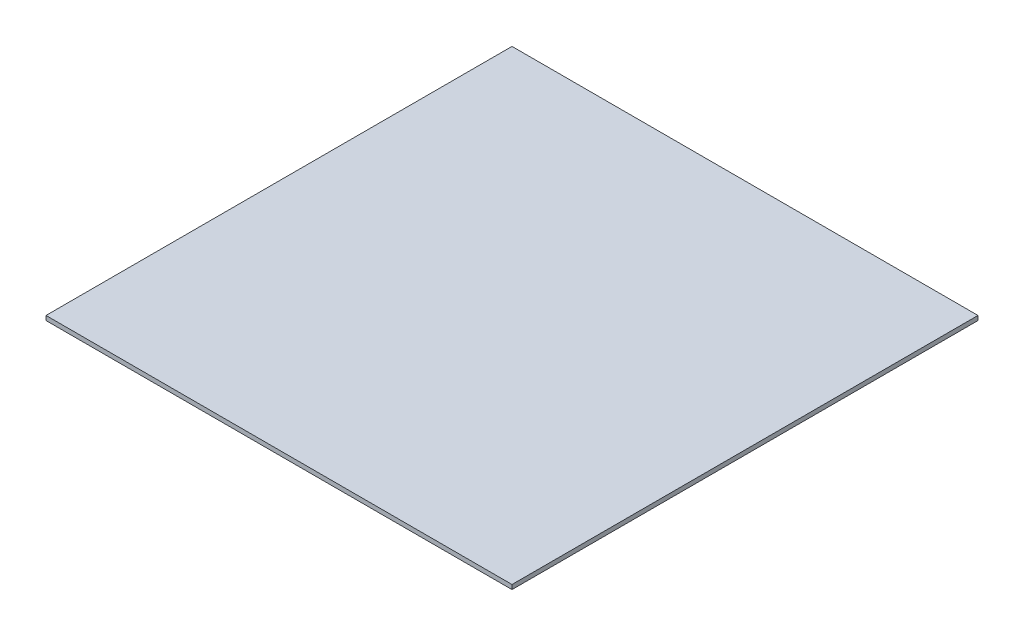
ISO-10303-21;
HEADER;
FILE_DESCRIPTION(('STEP AP214'),'2;1');
FILE_NAME('part.step','',(''),(''),'','','');
FILE_SCHEMA(('AUTOMOTIVE_DESIGN { 1 0 10303 214 1 1 1 1 }'));
ENDSEC;
DATA;
#1=APPLICATION_CONTEXT('core data for automotive mechanical design processes');
#2=APPLICATION_PROTOCOL_DEFINITION('international standard','automotive_design',2000,#1);
#3=PRODUCT_CONTEXT('',#1,'mechanical');
#4=PRODUCT('Part','Part','',(#3));
#5=PRODUCT_RELATED_PRODUCT_CATEGORY('part','',(#4));
#6=PRODUCT_DEFINITION_FORMATION('','',#4);
#7=PRODUCT_DEFINITION_CONTEXT('part definition',#1,'design');
#8=PRODUCT_DEFINITION('design','',#6,#7);
#9=PRODUCT_DEFINITION_SHAPE('','',#8);
#10=(LENGTH_UNIT() NAMED_UNIT(*) SI_UNIT(.MILLI.,.METRE.));
#11=(NAMED_UNIT(*) PLANE_ANGLE_UNIT() SI_UNIT($,.RADIAN.));
#12=(NAMED_UNIT(*) SI_UNIT($,.STERADIAN.) SOLID_ANGLE_UNIT());
#13=UNCERTAINTY_MEASURE_WITH_UNIT(LENGTH_MEASURE(1.E-05),#10,'distance_accuracy_value','');
#14=(GEOMETRIC_REPRESENTATION_CONTEXT(3) GLOBAL_UNCERTAINTY_ASSIGNED_CONTEXT((#13)) GLOBAL_UNIT_ASSIGNED_CONTEXT((#10,
#11,#12)) REPRESENTATION_CONTEXT('',''));
#15=CARTESIAN_POINT('',(0.,0.,0.));
#16=DIRECTION('',(0.,0.,1.));
#17=DIRECTION('',(1.,0.,0.));
#18=AXIS2_PLACEMENT_3D('',#15,#16,#17);
#19=CARTESIAN_POINT('',(105.,2.,-105.));
#20=DIRECTION('',(-1.,0.,0.));
#21=DIRECTION('',(0.,0.,1.));
#22=AXIS2_PLACEMENT_3D('',#19,#20,#21);
#23=PLANE('',#22);
#24=DIRECTION('',(0.,0.,-1.));
#25=VECTOR('',#24,1.);
#26=CARTESIAN_POINT('',(105.,0.,-105.));
#27=LINE('',#26,#25);
#28=CARTESIAN_POINT('',(105.,0.,105.));
#29=VERTEX_POINT('',#28);
#30=CARTESIAN_POINT('',(105.,0.,-105.));
#31=VERTEX_POINT('',#30);
#32=EDGE_CURVE('E96',#29,#31,#27,.T.);
#33=ORIENTED_EDGE('',*,*,#32,.T.);
#34=DIRECTION('',(0.,-1.,0.));
#35=VECTOR('',#34,1.);
#36=CARTESIAN_POINT('',(105.,2.,-105.));
#37=LINE('',#36,#35);
#38=CARTESIAN_POINT('',(105.,2.,-105.));
#39=VERTEX_POINT('',#38);
#40=EDGE_CURVE('E11',#39,#31,#37,.T.);
#41=ORIENTED_EDGE('',*,*,#40,.F.);
#42=DIRECTION('',(0.,0.,-1.));
#43=VECTOR('',#42,1.);
#44=CARTESIAN_POINT('',(105.,2.,-105.));
#45=LINE('',#44,#43);
#46=CARTESIAN_POINT('',(105.,2.,105.));
#47=VERTEX_POINT('',#46);
#48=EDGE_CURVE('E84',#47,#39,#45,.T.);
#49=ORIENTED_EDGE('',*,*,#48,.F.);
#50=DIRECTION('',(0.,-1.,0.));
#51=VECTOR('',#50,1.);
#52=CARTESIAN_POINT('',(105.,2.,105.));
#53=LINE('',#52,#51);
#54=EDGE_CURVE('E92',#47,#29,#53,.T.);
#55=ORIENTED_EDGE('',*,*,#54,.T.);
#56=EDGE_LOOP('',(#33,#41,#49,#55));
#57=FACE_BOUND('',#56,.T.);
#58=ADVANCED_FACE('F33',(#57),#23,.F.);
#59=CARTESIAN_POINT('',(-105.,2.,-105.));
#60=DIRECTION('',(0.,0.,1.));
#61=DIRECTION('',(1.,0.,0.));
#62=AXIS2_PLACEMENT_3D('',#59,#60,#61);
#63=PLANE('',#62);
#64=DIRECTION('',(-1.,0.,0.));
#65=VECTOR('',#64,1.);
#66=CARTESIAN_POINT('',(-105.,0.,-105.));
#67=LINE('',#66,#65);
#68=CARTESIAN_POINT('',(-105.,0.,-105.));
#69=VERTEX_POINT('',#68);
#70=EDGE_CURVE('E88',#31,#69,#67,.T.);
#71=ORIENTED_EDGE('',*,*,#70,.T.);
#72=DIRECTION('',(0.,-1.,0.));
#73=VECTOR('',#72,1.);
#74=CARTESIAN_POINT('',(-105.,2.,-105.));
#75=LINE('',#74,#73);
#76=CARTESIAN_POINT('',(-105.,2.,-105.));
#77=VERTEX_POINT('',#76);
#78=EDGE_CURVE('E41',#77,#69,#75,.T.);
#79=ORIENTED_EDGE('',*,*,#78,.F.);
#80=DIRECTION('',(-1.,0.,0.));
#81=VECTOR('',#80,1.);
#82=CARTESIAN_POINT('',(-105.,2.,-105.));
#83=LINE('',#82,#81);
#84=EDGE_CURVE('E79',#39,#77,#83,.T.);
#85=ORIENTED_EDGE('',*,*,#84,.F.);
#86=ORIENTED_EDGE('',*,*,#40,.T.);
#87=EDGE_LOOP('',(#71,#79,#85,#86));
#88=FACE_BOUND('',#87,.T.);
#89=ADVANCED_FACE('F87',(#88),#63,.F.);
#90=CARTESIAN_POINT('',(-105.,2.,-105.));
#91=DIRECTION('',(1.,0.,0.));
#92=DIRECTION('',(0.,0.,-1.));
#93=AXIS2_PLACEMENT_3D('',#90,#91,#92);
#94=PLANE('',#93);
#95=DIRECTION('',(0.,0.,1.));
#96=VECTOR('',#95,1.);
#97=CARTESIAN_POINT('',(-105.,0.,-105.));
#98=LINE('',#97,#96);
#99=CARTESIAN_POINT('',(-105.,0.,105.));
#100=VERTEX_POINT('',#99);
#101=EDGE_CURVE('E66',#69,#100,#98,.T.);
#102=ORIENTED_EDGE('',*,*,#101,.T.);
#103=DIRECTION('',(0.,-1.,0.));
#104=VECTOR('',#103,1.);
#105=CARTESIAN_POINT('',(-105.,2.,105.));
#106=LINE('',#105,#104);
#107=CARTESIAN_POINT('',(-105.,2.,105.));
#108=VERTEX_POINT('',#107);
#109=EDGE_CURVE('E89',#108,#100,#106,.T.);
#110=ORIENTED_EDGE('',*,*,#109,.F.);
#111=DIRECTION('',(0.,0.,1.));
#112=VECTOR('',#111,1.);
#113=CARTESIAN_POINT('',(-105.,2.,-105.));
#114=LINE('',#113,#112);
#115=EDGE_CURVE('E82',#77,#108,#114,.T.);
#116=ORIENTED_EDGE('',*,*,#115,.F.);
#117=ORIENTED_EDGE('',*,*,#78,.T.);
#118=EDGE_LOOP('',(#102,#110,#116,#117));
#119=FACE_BOUND('',#118,.T.);
#120=ADVANCED_FACE('F90',(#119),#94,.F.);
#121=CARTESIAN_POINT('',(-105.,2.,105.));
#122=DIRECTION('',(0.,0.,-1.));
#123=DIRECTION('',(-1.,0.,0.));
#124=AXIS2_PLACEMENT_3D('',#121,#122,#123);
#125=PLANE('',#124);
#126=DIRECTION('',(1.,0.,0.));
#127=VECTOR('',#126,1.);
#128=CARTESIAN_POINT('',(-105.,0.,105.));
#129=LINE('',#128,#127);
#130=EDGE_CURVE('E72',#100,#29,#129,.T.);
#131=ORIENTED_EDGE('',*,*,#130,.T.);
#132=ORIENTED_EDGE('',*,*,#54,.F.);
#133=DIRECTION('',(1.,0.,0.));
#134=VECTOR('',#133,1.);
#135=CARTESIAN_POINT('',(-105.,2.,105.));
#136=LINE('',#135,#134);
#137=EDGE_CURVE('E49',#108,#47,#136,.T.);
#138=ORIENTED_EDGE('',*,*,#137,.F.);
#139=ORIENTED_EDGE('',*,*,#109,.T.);
#140=EDGE_LOOP('',(#131,#132,#138,#139));
#141=FACE_BOUND('',#140,.T.);
#142=ADVANCED_FACE('F103',(#141),#125,.F.);
#143=CARTESIAN_POINT('',(0.,2.,0.));
#144=DIRECTION('',(0.,1.,0.));
#145=DIRECTION('',(0.,0.,1.));
#146=AXIS2_PLACEMENT_3D('',#143,#144,#145);
#147=PLANE('',#146);
#148=ORIENTED_EDGE('',*,*,#48,.T.);
#149=ORIENTED_EDGE('',*,*,#84,.T.);
#150=ORIENTED_EDGE('',*,*,#115,.T.);
#151=ORIENTED_EDGE('',*,*,#137,.T.);
#152=EDGE_LOOP('',(#148,#149,#150,#151));
#153=FACE_BOUND('',#152,.T.);
#154=ADVANCED_FACE('F80',(#153),#147,.T.);
#155=CARTESIAN_POINT('',(0.,0.,0.));
#156=DIRECTION('',(0.,1.,0.));
#157=DIRECTION('',(0.,0.,1.));
#158=AXIS2_PLACEMENT_3D('',#155,#156,#157);
#159=PLANE('',#158);
#160=ORIENTED_EDGE('',*,*,#32,.F.);
#161=ORIENTED_EDGE('',*,*,#130,.F.);
#162=ORIENTED_EDGE('',*,*,#101,.F.);
#163=ORIENTED_EDGE('',*,*,#70,.F.);
#164=EDGE_LOOP('',(#160,#161,#162,#163));
#165=FACE_BOUND('',#164,.T.);
#166=ADVANCED_FACE('F106',(#165),#159,.F.);
#167=CLOSED_SHELL('',(#58,#89,#120,#142,#154,#166));
#168=MANIFOLD_SOLID_BREP('B2',#167);
#169=ADVANCED_BREP_SHAPE_REPRESENTATION('',(#18,#168),#14);
#170=SHAPE_DEFINITION_REPRESENTATION(#9,#169);
ENDSEC;
END-ISO-10303-21;
